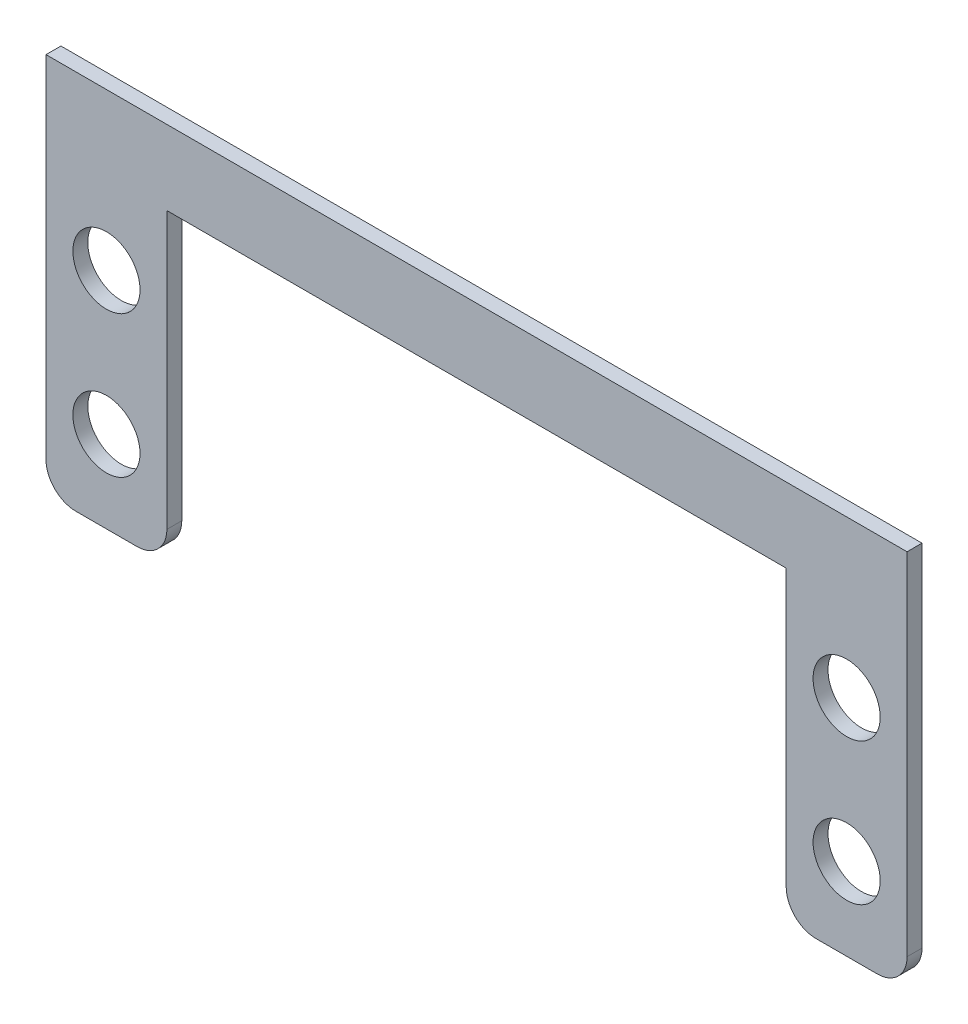
ISO-10303-21;
HEADER;
FILE_DESCRIPTION(('STEP AP214'),'2;1');
FILE_NAME('part.step','',(''),(''),'','','');
FILE_SCHEMA(('AUTOMOTIVE_DESIGN { 1 0 10303 214 1 1 1 1 }'));
ENDSEC;
DATA;
#1=APPLICATION_CONTEXT('core data for automotive mechanical design processes');
#2=APPLICATION_PROTOCOL_DEFINITION('international standard','automotive_design',2000,#1);
#3=PRODUCT_CONTEXT('',#1,'mechanical');
#4=PRODUCT('Part','Part','',(#3));
#5=PRODUCT_RELATED_PRODUCT_CATEGORY('part','',(#4));
#6=PRODUCT_DEFINITION_FORMATION('','',#4);
#7=PRODUCT_DEFINITION_CONTEXT('part definition',#1,'design');
#8=PRODUCT_DEFINITION('design','',#6,#7);
#9=PRODUCT_DEFINITION_SHAPE('','',#8);
#10=(LENGTH_UNIT() NAMED_UNIT(*) SI_UNIT(.MILLI.,.METRE.));
#11=(NAMED_UNIT(*) PLANE_ANGLE_UNIT() SI_UNIT($,.RADIAN.));
#12=(NAMED_UNIT(*) SI_UNIT($,.STERADIAN.) SOLID_ANGLE_UNIT());
#13=UNCERTAINTY_MEASURE_WITH_UNIT(LENGTH_MEASURE(1.E-05),#10,'distance_accuracy_value','');
#14=(GEOMETRIC_REPRESENTATION_CONTEXT(3) GLOBAL_UNCERTAINTY_ASSIGNED_CONTEXT((#13)) GLOBAL_UNIT_ASSIGNED_CONTEXT((#10,
#11,#12)) REPRESENTATION_CONTEXT('',''));
#15=CARTESIAN_POINT('',(0.,0.,0.));
#16=DIRECTION('',(0.,0.,1.));
#17=DIRECTION('',(1.,0.,0.));
#18=AXIS2_PLACEMENT_3D('',#15,#16,#17);
#19=CARTESIAN_POINT('',(6.10000000000278,-18.5,1.));
#20=DIRECTION('',(0.,0.,-1.));
#21=DIRECTION('',(-1.,0.,0.));
#22=AXIS2_PLACEMENT_3D('',#19,#20,#21);
#23=CYLINDRICAL_SURFACE('',#22,2.);
#24=CARTESIAN_POINT('',(6.10000000000278,-18.5,0.));
#25=DIRECTION('',(0.,0.,1.));
#26=DIRECTION('',(1.,0.,0.));
#27=AXIS2_PLACEMENT_3D('',#24,#25,#26);
#28=CIRCLE('',#27,2.);
#29=CARTESIAN_POINT('',(8.10000000000278,-18.5,0.));
#30=VERTEX_POINT('',#29);
#31=CARTESIAN_POINT('',(6.10000000000277,-20.5,0.));
#32=VERTEX_POINT('',#31);
#33=EDGE_CURVE('E168',#30,#32,#28,.F.);
#34=ORIENTED_EDGE('',*,*,#33,.F.);
#35=DIRECTION('',(0.,0.,-1.));
#36=VECTOR('',#35,1.);
#37=CARTESIAN_POINT('',(8.10000000000278,-18.5,1.));
#38=LINE('',#37,#36);
#39=CARTESIAN_POINT('',(8.10000000000278,-18.5,1.));
#40=VERTEX_POINT('',#39);
#41=EDGE_CURVE('E11',#40,#30,#38,.T.);
#42=ORIENTED_EDGE('',*,*,#41,.F.);
#43=CARTESIAN_POINT('',(6.10000000000278,-18.5,1.));
#44=DIRECTION('',(0.,0.,1.));
#45=DIRECTION('',(1.,0.,0.));
#46=AXIS2_PLACEMENT_3D('',#43,#44,#45);
#47=CIRCLE('',#46,2.);
#48=CARTESIAN_POINT('',(6.10000000000277,-20.5,1.));
#49=VERTEX_POINT('',#48);
#50=EDGE_CURVE('E212',#40,#49,#47,.F.);
#51=ORIENTED_EDGE('',*,*,#50,.T.);
#52=DIRECTION('',(0.,0.,-1.));
#53=VECTOR('',#52,1.);
#54=CARTESIAN_POINT('',(6.10000000000277,-20.5,1.));
#55=LINE('',#54,#53);
#56=EDGE_CURVE('E54',#49,#32,#55,.T.);
#57=ORIENTED_EDGE('',*,*,#56,.T.);
#58=EDGE_LOOP('',(#34,#42,#51,#57));
#59=FACE_BOUND('',#58,.T.);
#60=ADVANCED_FACE('F38',(#59),#23,.T.);
#61=CARTESIAN_POINT('',(8.10000000000278,0.,1.));
#62=DIRECTION('',(1.,0.,0.));
#63=DIRECTION('',(0.,1.,0.));
#64=AXIS2_PLACEMENT_3D('',#61,#62,#63);
#65=PLANE('',#64);
#66=DIRECTION('',(0.,-1.,0.));
#67=VECTOR('',#66,1.);
#68=CARTESIAN_POINT('',(8.10000000000278,0.,0.));
#69=LINE('',#68,#67);
#70=CARTESIAN_POINT('',(8.10000000000278,4.99999999999987,0.));
#71=VERTEX_POINT('',#70);
#72=EDGE_CURVE('E170',#71,#30,#69,.T.);
#73=ORIENTED_EDGE('',*,*,#72,.F.);
#74=DIRECTION('',(0.,0.,-1.));
#75=VECTOR('',#74,1.);
#76=CARTESIAN_POINT('',(8.10000000000278,4.99999999999987,1.));
#77=LINE('',#76,#75);
#78=CARTESIAN_POINT('',(8.10000000000278,4.99999999999987,1.));
#79=VERTEX_POINT('',#78);
#80=EDGE_CURVE('E46',#79,#71,#77,.T.);
#81=ORIENTED_EDGE('',*,*,#80,.F.);
#82=DIRECTION('',(0.,-1.,0.));
#83=VECTOR('',#82,1.);
#84=CARTESIAN_POINT('',(8.10000000000278,0.,1.));
#85=LINE('',#84,#83);
#86=EDGE_CURVE('E250',#79,#40,#85,.T.);
#87=ORIENTED_EDGE('',*,*,#86,.T.);
#88=ORIENTED_EDGE('',*,*,#41,.T.);
#89=EDGE_LOOP('',(#73,#81,#87,#88));
#90=FACE_BOUND('',#89,.T.);
#91=ADVANCED_FACE('F237',(#90),#65,.T.);
#92=CARTESIAN_POINT('',(0.,4.99999999999987,1.));
#93=DIRECTION('',(0.,1.,0.));
#94=DIRECTION('',(0.,0.,1.));
#95=AXIS2_PLACEMENT_3D('',#92,#93,#94);
#96=PLANE('',#95);
#97=DIRECTION('',(1.,0.,0.));
#98=VECTOR('',#97,1.);
#99=CARTESIAN_POINT('',(0.,4.99999999999987,0.));
#100=LINE('',#99,#98);
#101=CARTESIAN_POINT('',(-49.6000000000183,4.99999999999987,0.));
#102=VERTEX_POINT('',#101);
#103=EDGE_CURVE('E173',#102,#71,#100,.T.);
#104=ORIENTED_EDGE('',*,*,#103,.F.);
#105=DIRECTION('',(0.,0.,-1.));
#106=VECTOR('',#105,1.);
#107=CARTESIAN_POINT('',(-49.6000000000183,4.99999999999987,1.));
#108=LINE('',#107,#106);
#109=CARTESIAN_POINT('',(-49.6000000000183,4.99999999999987,1.));
#110=VERTEX_POINT('',#109);
#111=EDGE_CURVE('E226',#110,#102,#108,.T.);
#112=ORIENTED_EDGE('',*,*,#111,.F.);
#113=DIRECTION('',(1.,0.,0.));
#114=VECTOR('',#113,1.);
#115=CARTESIAN_POINT('',(0.,4.99999999999987,1.));
#116=LINE('',#115,#114);
#117=EDGE_CURVE('E233',#110,#79,#116,.T.);
#118=ORIENTED_EDGE('',*,*,#117,.T.);
#119=ORIENTED_EDGE('',*,*,#80,.T.);
#120=EDGE_LOOP('',(#104,#112,#118,#119));
#121=FACE_BOUND('',#120,.T.);
#122=ADVANCED_FACE('F231',(#121),#96,.T.);
#123=CARTESIAN_POINT('',(-49.6000000000183,0.,1.));
#124=DIRECTION('',(-1.,0.,0.));
#125=DIRECTION('',(0.,0.,1.));
#126=AXIS2_PLACEMENT_3D('',#123,#124,#125);
#127=PLANE('',#126);
#128=DIRECTION('',(0.,1.,0.));
#129=VECTOR('',#128,1.);
#130=CARTESIAN_POINT('',(-49.6000000000183,0.,0.));
#131=LINE('',#130,#129);
#132=CARTESIAN_POINT('',(-49.6000000000183,-18.5,0.));
#133=VERTEX_POINT('',#132);
#134=EDGE_CURVE('E176',#133,#102,#131,.T.);
#135=ORIENTED_EDGE('',*,*,#134,.F.);
#136=DIRECTION('',(0.,0.,-1.));
#137=VECTOR('',#136,1.);
#138=CARTESIAN_POINT('',(-49.6000000000183,-18.5,1.));
#139=LINE('',#138,#137);
#140=CARTESIAN_POINT('',(-49.6000000000183,-18.5,1.));
#141=VERTEX_POINT('',#140);
#142=EDGE_CURVE('E224',#141,#133,#139,.T.);
#143=ORIENTED_EDGE('',*,*,#142,.F.);
#144=DIRECTION('',(0.,1.,0.));
#145=VECTOR('',#144,1.);
#146=CARTESIAN_POINT('',(-49.6000000000183,0.,1.));
#147=LINE('',#146,#145);
#148=EDGE_CURVE('E247',#141,#110,#147,.T.);
#149=ORIENTED_EDGE('',*,*,#148,.T.);
#150=ORIENTED_EDGE('',*,*,#111,.T.);
#151=EDGE_LOOP('',(#135,#143,#149,#150));
#152=FACE_BOUND('',#151,.T.);
#153=ADVANCED_FACE('F244',(#152),#127,.T.);
#154=CARTESIAN_POINT('',(-47.6000000000183,-18.5,1.));
#155=DIRECTION('',(0.,0.,-1.));
#156=DIRECTION('',(-1.,0.,0.));
#157=AXIS2_PLACEMENT_3D('',#154,#155,#156);
#158=CYLINDRICAL_SURFACE('',#157,2.);
#159=CARTESIAN_POINT('',(-47.6000000000183,-18.5,0.));
#160=DIRECTION('',(0.,0.,1.));
#161=DIRECTION('',(1.,0.,0.));
#162=AXIS2_PLACEMENT_3D('',#159,#160,#161);
#163=CIRCLE('',#162,2.);
#164=CARTESIAN_POINT('',(-47.6000000000183,-20.5,0.));
#165=VERTEX_POINT('',#164);
#166=EDGE_CURVE('E179',#165,#133,#163,.F.);
#167=ORIENTED_EDGE('',*,*,#166,.F.);
#168=DIRECTION('',(0.,0.,-1.));
#169=VECTOR('',#168,1.);
#170=CARTESIAN_POINT('',(-47.6000000000183,-20.5,1.));
#171=LINE('',#170,#169);
#172=CARTESIAN_POINT('',(-47.6000000000183,-20.5,1.));
#173=VERTEX_POINT('',#172);
#174=EDGE_CURVE('E222',#173,#165,#171,.T.);
#175=ORIENTED_EDGE('',*,*,#174,.F.);
#176=CARTESIAN_POINT('',(-47.6000000000183,-18.5,1.));
#177=DIRECTION('',(0.,0.,1.));
#178=DIRECTION('',(1.,0.,0.));
#179=AXIS2_PLACEMENT_3D('',#176,#177,#178);
#180=CIRCLE('',#179,2.);
#181=EDGE_CURVE('E252',#173,#141,#180,.F.);
#182=ORIENTED_EDGE('',*,*,#181,.T.);
#183=ORIENTED_EDGE('',*,*,#142,.T.);
#184=EDGE_LOOP('',(#167,#175,#182,#183));
#185=FACE_BOUND('',#184,.T.);
#186=ADVANCED_FACE('F296',(#185),#158,.T.);
#187=CARTESIAN_POINT('',(0.,-20.4999999999999,1.));
#188=DIRECTION('',(0.,-1.,0.));
#189=DIRECTION('',(1.,0.,0.));
#190=AXIS2_PLACEMENT_3D('',#187,#188,#189);
#191=PLANE('',#190);
#192=DIRECTION('',(-1.,0.,0.));
#193=VECTOR('',#192,1.);
#194=CARTESIAN_POINT('',(0.,-20.4999999999999,0.));
#195=LINE('',#194,#193);
#196=CARTESIAN_POINT('',(-43.5,-20.5,0.));
#197=VERTEX_POINT('',#196);
#198=EDGE_CURVE('E182',#197,#165,#195,.T.);
#199=ORIENTED_EDGE('',*,*,#198,.F.);
#200=DIRECTION('',(0.,0.,-1.));
#201=VECTOR('',#200,1.);
#202=CARTESIAN_POINT('',(-43.5,-20.5,1.));
#203=LINE('',#202,#201);
#204=CARTESIAN_POINT('',(-43.5,-20.5,1.));
#205=VERTEX_POINT('',#204);
#206=EDGE_CURVE('E220',#205,#197,#203,.T.);
#207=ORIENTED_EDGE('',*,*,#206,.F.);
#208=DIRECTION('',(-1.,0.,0.));
#209=VECTOR('',#208,1.);
#210=CARTESIAN_POINT('',(0.,-20.4999999999999,1.));
#211=LINE('',#210,#209);
#212=EDGE_CURVE('E258',#205,#173,#211,.T.);
#213=ORIENTED_EDGE('',*,*,#212,.T.);
#214=ORIENTED_EDGE('',*,*,#174,.T.);
#215=EDGE_LOOP('',(#199,#207,#213,#214));
#216=FACE_BOUND('',#215,.T.);
#217=ADVANCED_FACE('F299',(#216),#191,.T.);
#218=CARTESIAN_POINT('',(-43.5,-18.5,1.));
#219=DIRECTION('',(0.,0.,-1.));
#220=DIRECTION('',(-1.,0.,0.));
#221=AXIS2_PLACEMENT_3D('',#218,#219,#220);
#222=CYLINDRICAL_SURFACE('',#221,2.);
#223=CARTESIAN_POINT('',(-43.5,-18.5,0.));
#224=DIRECTION('',(0.,0.,1.));
#225=DIRECTION('',(1.,0.,0.));
#226=AXIS2_PLACEMENT_3D('',#223,#224,#225);
#227=CIRCLE('',#226,2.);
#228=CARTESIAN_POINT('',(-41.5,-18.5,0.));
#229=VERTEX_POINT('',#228);
#230=EDGE_CURVE('E185',#229,#197,#227,.F.);
#231=ORIENTED_EDGE('',*,*,#230,.F.);
#232=DIRECTION('',(0.,0.,-1.));
#233=VECTOR('',#232,1.);
#234=CARTESIAN_POINT('',(-41.5,-18.5,1.));
#235=LINE('',#234,#233);
#236=CARTESIAN_POINT('',(-41.5,-18.5,1.));
#237=VERTEX_POINT('',#236);
#238=EDGE_CURVE('E218',#237,#229,#235,.T.);
#239=ORIENTED_EDGE('',*,*,#238,.F.);
#240=CARTESIAN_POINT('',(-43.5,-18.5,1.));
#241=DIRECTION('',(0.,0.,1.));
#242=DIRECTION('',(1.,0.,0.));
#243=AXIS2_PLACEMENT_3D('',#240,#241,#242);
#244=CIRCLE('',#243,2.);
#245=EDGE_CURVE('E261',#237,#205,#244,.F.);
#246=ORIENTED_EDGE('',*,*,#245,.T.);
#247=ORIENTED_EDGE('',*,*,#206,.T.);
#248=EDGE_LOOP('',(#231,#239,#246,#247));
#249=FACE_BOUND('',#248,.T.);
#250=ADVANCED_FACE('F303',(#249),#222,.T.);
#251=CARTESIAN_POINT('',(-41.5,0.,1.));
#252=DIRECTION('',(1.,0.,0.));
#253=DIRECTION('',(0.,0.,-1.));
#254=AXIS2_PLACEMENT_3D('',#251,#252,#253);
#255=PLANE('',#254);
#256=DIRECTION('',(0.,-1.,0.));
#257=VECTOR('',#256,1.);
#258=CARTESIAN_POINT('',(-41.5,0.,0.));
#259=LINE('',#258,#257);
#260=CARTESIAN_POINT('',(-41.5,0.,0.));
#261=VERTEX_POINT('',#260);
#262=EDGE_CURVE('E188',#261,#229,#259,.T.);
#263=ORIENTED_EDGE('',*,*,#262,.F.);
#264=DIRECTION('',(0.,0.,-1.));
#265=VECTOR('',#264,1.);
#266=CARTESIAN_POINT('',(-41.5,0.,1.));
#267=LINE('',#266,#265);
#268=CARTESIAN_POINT('',(-41.5,0.,1.));
#269=VERTEX_POINT('',#268);
#270=EDGE_CURVE('E216',#269,#261,#267,.T.);
#271=ORIENTED_EDGE('',*,*,#270,.F.);
#272=DIRECTION('',(0.,-1.,0.));
#273=VECTOR('',#272,1.);
#274=CARTESIAN_POINT('',(-41.5,0.,1.));
#275=LINE('',#274,#273);
#276=EDGE_CURVE('E264',#269,#237,#275,.T.);
#277=ORIENTED_EDGE('',*,*,#276,.T.);
#278=ORIENTED_EDGE('',*,*,#238,.T.);
#279=EDGE_LOOP('',(#263,#271,#277,#278));
#280=FACE_BOUND('',#279,.T.);
#281=ADVANCED_FACE('F307',(#280),#255,.T.);
#282=CARTESIAN_POINT('',(0.,0.,1.));
#283=DIRECTION('',(0.,-1.,0.));
#284=DIRECTION('',(1.,0.,0.));
#285=AXIS2_PLACEMENT_3D('',#282,#283,#284);
#286=PLANE('',#285);
#287=DIRECTION('',(-1.,0.,0.));
#288=VECTOR('',#287,1.);
#289=CARTESIAN_POINT('',(0.,0.,0.));
#290=LINE('',#289,#288);
#291=CARTESIAN_POINT('',(0.,0.,0.));
#292=VERTEX_POINT('',#291);
#293=EDGE_CURVE('E191',#292,#261,#290,.T.);
#294=ORIENTED_EDGE('',*,*,#293,.F.);
#295=DIRECTION('',(0.,0.,-1.));
#296=VECTOR('',#295,1.);
#297=CARTESIAN_POINT('',(0.,0.,1.));
#298=LINE('',#297,#296);
#299=CARTESIAN_POINT('',(0.,0.,1.));
#300=VERTEX_POINT('',#299);
#301=EDGE_CURVE('E148',#300,#292,#298,.T.);
#302=ORIENTED_EDGE('',*,*,#301,.F.);
#303=DIRECTION('',(-1.,0.,0.));
#304=VECTOR('',#303,1.);
#305=CARTESIAN_POINT('',(0.,0.,1.));
#306=LINE('',#305,#304);
#307=EDGE_CURVE('E138',#300,#269,#306,.T.);
#308=ORIENTED_EDGE('',*,*,#307,.T.);
#309=ORIENTED_EDGE('',*,*,#270,.T.);
#310=EDGE_LOOP('',(#294,#302,#308,#309));
#311=FACE_BOUND('',#310,.T.);
#312=ADVANCED_FACE('F268',(#311),#286,.T.);
#313=CARTESIAN_POINT('',(0.,0.,1.));
#314=DIRECTION('',(1.,0.,0.));
#315=DIRECTION('',(0.,1.,0.));
#316=AXIS2_PLACEMENT_3D('',#313,#314,#315);
#317=PLANE('',#316);
#318=DIRECTION('',(0.,-1.,0.));
#319=VECTOR('',#318,1.);
#320=CARTESIAN_POINT('',(0.,0.,0.));
#321=LINE('',#320,#319);
#322=CARTESIAN_POINT('',(0.,-18.5,0.));
#323=VERTEX_POINT('',#322);
#324=EDGE_CURVE('E145',#292,#323,#321,.T.);
#325=ORIENTED_EDGE('',*,*,#324,.T.);
#326=DIRECTION('',(0.,0.,-1.));
#327=VECTOR('',#326,1.);
#328=CARTESIAN_POINT('',(0.,-18.5,1.));
#329=LINE('',#328,#327);
#330=CARTESIAN_POINT('',(0.,-18.5,1.));
#331=VERTEX_POINT('',#330);
#332=EDGE_CURVE('E142',#331,#323,#329,.T.);
#333=ORIENTED_EDGE('',*,*,#332,.F.);
#334=DIRECTION('',(0.,-1.,0.));
#335=VECTOR('',#334,1.);
#336=CARTESIAN_POINT('',(0.,0.,1.));
#337=LINE('',#336,#335);
#338=EDGE_CURVE('E129',#300,#331,#337,.T.);
#339=ORIENTED_EDGE('',*,*,#338,.F.);
#340=ORIENTED_EDGE('',*,*,#301,.T.);
#341=EDGE_LOOP('',(#325,#333,#339,#340));
#342=FACE_BOUND('',#341,.T.);
#343=ADVANCED_FACE('F143',(#342),#317,.F.);
#344=CARTESIAN_POINT('',(2.,-18.5,1.));
#345=DIRECTION('',(0.,0.,-1.));
#346=DIRECTION('',(-1.,0.,0.));
#347=AXIS2_PLACEMENT_3D('',#344,#345,#346);
#348=CYLINDRICAL_SURFACE('',#347,2.);
#349=CARTESIAN_POINT('',(2.,-18.5,0.));
#350=DIRECTION('',(0.,0.,1.));
#351=DIRECTION('',(1.,0.,0.));
#352=AXIS2_PLACEMENT_3D('',#349,#350,#351);
#353=CIRCLE('',#352,2.);
#354=CARTESIAN_POINT('',(2.00000000000002,-20.5,0.));
#355=VERTEX_POINT('',#354);
#356=EDGE_CURVE('E195',#323,#355,#353,.T.);
#357=ORIENTED_EDGE('',*,*,#356,.T.);
#358=DIRECTION('',(0.,0.,-1.));
#359=VECTOR('',#358,1.);
#360=CARTESIAN_POINT('',(2.00000000000002,-20.5,1.));
#361=LINE('',#360,#359);
#362=CARTESIAN_POINT('',(2.00000000000002,-20.5,1.));
#363=VERTEX_POINT('',#362);
#364=EDGE_CURVE('E92',#363,#355,#361,.T.);
#365=ORIENTED_EDGE('',*,*,#364,.F.);
#366=CARTESIAN_POINT('',(2.,-18.5,1.));
#367=DIRECTION('',(0.,0.,1.));
#368=DIRECTION('',(1.,0.,0.));
#369=AXIS2_PLACEMENT_3D('',#366,#367,#368);
#370=CIRCLE('',#369,2.);
#371=EDGE_CURVE('E135',#331,#363,#370,.T.);
#372=ORIENTED_EDGE('',*,*,#371,.F.);
#373=ORIENTED_EDGE('',*,*,#332,.T.);
#374=EDGE_LOOP('',(#357,#365,#372,#373));
#375=FACE_BOUND('',#374,.T.);
#376=ADVANCED_FACE('F150',(#375),#348,.T.);
#377=CARTESIAN_POINT('',(-45.5499999999999,-15.,1.));
#378=DIRECTION('',(0.,0.,-1.));
#379=DIRECTION('',(-1.,0.,0.));
#380=AXIS2_PLACEMENT_3D('',#377,#378,#379);
#381=CYLINDRICAL_SURFACE('',#380,2.25);
#382=CARTESIAN_POINT('',(-45.5499999999999,-15.,1.));
#383=DIRECTION('',(0.,0.,1.));
#384=DIRECTION('',(1.,0.,0.));
#385=AXIS2_PLACEMENT_3D('',#382,#383,#384);
#386=CIRCLE('',#385,2.25);
#387=CARTESIAN_POINT('',(-43.2999999999999,-15.,1.));
#388=VERTEX_POINT('',#387);
#389=EDGE_CURVE('E162',#388,#388,#386,.T.);
#390=ORIENTED_EDGE('',*,*,#389,.T.);
#391=EDGE_LOOP('',(#390));
#392=FACE_BOUND('',#391,.T.);
#393=CARTESIAN_POINT('',(-45.5499999999999,-15.,0.));
#394=DIRECTION('',(0.,0.,1.));
#395=DIRECTION('',(1.,0.,0.));
#396=AXIS2_PLACEMENT_3D('',#393,#394,#395);
#397=CIRCLE('',#396,2.25);
#398=CARTESIAN_POINT('',(-43.2999999999999,-15.,0.));
#399=VERTEX_POINT('',#398);
#400=EDGE_CURVE('E206',#399,#399,#397,.T.);
#401=ORIENTED_EDGE('',*,*,#400,.F.);
#402=EDGE_LOOP('',(#401));
#403=FACE_BOUND('',#402,.T.);
#404=ADVANCED_FACE('F316',(#392,#403),#381,.F.);
#405=CARTESIAN_POINT('',(4.05000000000012,-5.5,1.));
#406=DIRECTION('',(0.,0.,-1.));
#407=DIRECTION('',(-1.,0.,0.));
#408=AXIS2_PLACEMENT_3D('',#405,#406,#407);
#409=CYLINDRICAL_SURFACE('',#408,2.25);
#410=CARTESIAN_POINT('',(4.05000000000012,-5.5,1.));
#411=DIRECTION('',(0.,0.,1.));
#412=DIRECTION('',(1.,0.,0.));
#413=AXIS2_PLACEMENT_3D('',#410,#411,#412);
#414=CIRCLE('',#413,2.25);
#415=CARTESIAN_POINT('',(6.30000000000012,-5.5,1.));
#416=VERTEX_POINT('',#415);
#417=EDGE_CURVE('E159',#416,#416,#414,.T.);
#418=ORIENTED_EDGE('',*,*,#417,.T.);
#419=EDGE_LOOP('',(#418));
#420=FACE_BOUND('',#419,.T.);
#421=CARTESIAN_POINT('',(4.05000000000012,-5.5,0.));
#422=DIRECTION('',(0.,0.,1.));
#423=DIRECTION('',(1.,0.,0.));
#424=AXIS2_PLACEMENT_3D('',#421,#422,#423);
#425=CIRCLE('',#424,2.25);
#426=CARTESIAN_POINT('',(6.30000000000012,-5.5,0.));
#427=VERTEX_POINT('',#426);
#428=EDGE_CURVE('E203',#427,#427,#425,.T.);
#429=ORIENTED_EDGE('',*,*,#428,.F.);
#430=EDGE_LOOP('',(#429));
#431=FACE_BOUND('',#430,.T.);
#432=ADVANCED_FACE('F281',(#420,#431),#409,.F.);
#433=CARTESIAN_POINT('',(4.05000000000012,-15.,1.));
#434=DIRECTION('',(0.,0.,-1.));
#435=DIRECTION('',(-1.,0.,0.));
#436=AXIS2_PLACEMENT_3D('',#433,#434,#435);
#437=CYLINDRICAL_SURFACE('',#436,2.25);
#438=CARTESIAN_POINT('',(4.05000000000012,-15.,1.));
#439=DIRECTION('',(0.,0.,1.));
#440=DIRECTION('',(1.,0.,0.));
#441=AXIS2_PLACEMENT_3D('',#438,#439,#440);
#442=CIRCLE('',#441,2.25);
#443=CARTESIAN_POINT('',(6.30000000000012,-15.,1.));
#444=VERTEX_POINT('',#443);
#445=EDGE_CURVE('E153',#444,#444,#442,.T.);
#446=ORIENTED_EDGE('',*,*,#445,.T.);
#447=EDGE_LOOP('',(#446));
#448=FACE_BOUND('',#447,.T.);
#449=CARTESIAN_POINT('',(4.05000000000012,-15.,0.));
#450=DIRECTION('',(0.,0.,1.));
#451=DIRECTION('',(1.,0.,0.));
#452=AXIS2_PLACEMENT_3D('',#449,#450,#451);
#453=CIRCLE('',#452,2.25);
#454=CARTESIAN_POINT('',(6.30000000000012,-15.,0.));
#455=VERTEX_POINT('',#454);
#456=EDGE_CURVE('E200',#455,#455,#453,.T.);
#457=ORIENTED_EDGE('',*,*,#456,.F.);
#458=EDGE_LOOP('',(#457));
#459=FACE_BOUND('',#458,.T.);
#460=ADVANCED_FACE('F273',(#448,#459),#437,.F.);
#461=CARTESIAN_POINT('',(0.,-20.5,1.));
#462=DIRECTION('',(0.,-1.,0.));
#463=DIRECTION('',(0.,0.,-1.));
#464=AXIS2_PLACEMENT_3D('',#461,#462,#463);
#465=PLANE('',#464);
#466=DIRECTION('',(-1.,0.,0.));
#467=VECTOR('',#466,1.);
#468=CARTESIAN_POINT('',(0.,-20.5,0.));
#469=LINE('',#468,#467);
#470=EDGE_CURVE('E197',#32,#355,#469,.T.);
#471=ORIENTED_EDGE('',*,*,#470,.F.);
#472=ORIENTED_EDGE('',*,*,#56,.F.);
#473=DIRECTION('',(-1.,0.,0.));
#474=VECTOR('',#473,1.);
#475=CARTESIAN_POINT('',(0.,-20.5,1.));
#476=LINE('',#475,#474);
#477=EDGE_CURVE('E151',#49,#363,#476,.T.);
#478=ORIENTED_EDGE('',*,*,#477,.T.);
#479=ORIENTED_EDGE('',*,*,#364,.T.);
#480=EDGE_LOOP('',(#471,#472,#478,#479));
#481=FACE_BOUND('',#480,.T.);
#482=ADVANCED_FACE('F270',(#481),#465,.T.);
#483=CARTESIAN_POINT('',(-45.5499999999999,-5.50000000000001,1.));
#484=DIRECTION('',(0.,0.,-1.));
#485=DIRECTION('',(-1.,0.,0.));
#486=AXIS2_PLACEMENT_3D('',#483,#484,#485);
#487=CYLINDRICAL_SURFACE('',#486,2.25);
#488=CARTESIAN_POINT('',(-45.5499999999999,-5.50000000000001,1.));
#489=DIRECTION('',(0.,0.,1.));
#490=DIRECTION('',(1.,0.,0.));
#491=AXIS2_PLACEMENT_3D('',#488,#489,#490);
#492=CIRCLE('',#491,2.25);
#493=CARTESIAN_POINT('',(-43.2999999999999,-5.50000000000001,1.));
#494=VERTEX_POINT('',#493);
#495=EDGE_CURVE('E165',#494,#494,#492,.T.);
#496=ORIENTED_EDGE('',*,*,#495,.T.);
#497=EDGE_LOOP('',(#496));
#498=FACE_BOUND('',#497,.T.);
#499=CARTESIAN_POINT('',(-45.5499999999999,-5.50000000000001,0.));
#500=DIRECTION('',(0.,0.,1.));
#501=DIRECTION('',(1.,0.,0.));
#502=AXIS2_PLACEMENT_3D('',#499,#500,#501);
#503=CIRCLE('',#502,2.25);
#504=CARTESIAN_POINT('',(-43.2999999999999,-5.50000000000001,0.));
#505=VERTEX_POINT('',#504);
#506=EDGE_CURVE('E209',#505,#505,#503,.T.);
#507=ORIENTED_EDGE('',*,*,#506,.F.);
#508=EDGE_LOOP('',(#507));
#509=FACE_BOUND('',#508,.T.);
#510=ADVANCED_FACE('F272',(#498,#509),#487,.F.);
#511=CARTESIAN_POINT('',(0.,0.,1.));
#512=DIRECTION('',(0.,0.,1.));
#513=DIRECTION('',(1.,0.,0.));
#514=AXIS2_PLACEMENT_3D('',#511,#512,#513);
#515=PLANE('',#514);
#516=ORIENTED_EDGE('',*,*,#50,.F.);
#517=ORIENTED_EDGE('',*,*,#86,.F.);
#518=ORIENTED_EDGE('',*,*,#117,.F.);
#519=ORIENTED_EDGE('',*,*,#148,.F.);
#520=ORIENTED_EDGE('',*,*,#181,.F.);
#521=ORIENTED_EDGE('',*,*,#212,.F.);
#522=ORIENTED_EDGE('',*,*,#245,.F.);
#523=ORIENTED_EDGE('',*,*,#276,.F.);
#524=ORIENTED_EDGE('',*,*,#307,.F.);
#525=ORIENTED_EDGE('',*,*,#338,.T.);
#526=ORIENTED_EDGE('',*,*,#371,.T.);
#527=ORIENTED_EDGE('',*,*,#477,.F.);
#528=EDGE_LOOP('',(#516,#517,#518,#519,#520,#521,#522,#523,#524,#525,#526,#527));
#529=FACE_BOUND('',#528,.T.);
#530=ORIENTED_EDGE('',*,*,#445,.F.);
#531=EDGE_LOOP('',(#530));
#532=FACE_BOUND('',#531,.T.);
#533=ORIENTED_EDGE('',*,*,#417,.F.);
#534=EDGE_LOOP('',(#533));
#535=FACE_BOUND('',#534,.T.);
#536=ORIENTED_EDGE('',*,*,#389,.F.);
#537=EDGE_LOOP('',(#536));
#538=FACE_BOUND('',#537,.T.);
#539=ORIENTED_EDGE('',*,*,#495,.F.);
#540=EDGE_LOOP('',(#539));
#541=FACE_BOUND('',#540,.T.);
#542=ADVANCED_FACE('F131',(#529,#532,#535,#538,#541),#515,.T.);
#543=CARTESIAN_POINT('',(0.,0.,0.));
#544=DIRECTION('',(0.,0.,1.));
#545=DIRECTION('',(1.,0.,0.));
#546=AXIS2_PLACEMENT_3D('',#543,#544,#545);
#547=PLANE('',#546);
#548=ORIENTED_EDGE('',*,*,#33,.T.);
#549=ORIENTED_EDGE('',*,*,#470,.T.);
#550=ORIENTED_EDGE('',*,*,#356,.F.);
#551=ORIENTED_EDGE('',*,*,#324,.F.);
#552=ORIENTED_EDGE('',*,*,#293,.T.);
#553=ORIENTED_EDGE('',*,*,#262,.T.);
#554=ORIENTED_EDGE('',*,*,#230,.T.);
#555=ORIENTED_EDGE('',*,*,#198,.T.);
#556=ORIENTED_EDGE('',*,*,#166,.T.);
#557=ORIENTED_EDGE('',*,*,#134,.T.);
#558=ORIENTED_EDGE('',*,*,#103,.T.);
#559=ORIENTED_EDGE('',*,*,#72,.T.);
#560=EDGE_LOOP('',(#548,#549,#550,#551,#552,#553,#554,#555,#556,#557,#558,#559));
#561=FACE_BOUND('',#560,.T.);
#562=ORIENTED_EDGE('',*,*,#456,.T.);
#563=EDGE_LOOP('',(#562));
#564=FACE_BOUND('',#563,.T.);
#565=ORIENTED_EDGE('',*,*,#428,.T.);
#566=EDGE_LOOP('',(#565));
#567=FACE_BOUND('',#566,.T.);
#568=ORIENTED_EDGE('',*,*,#400,.T.);
#569=EDGE_LOOP('',(#568));
#570=FACE_BOUND('',#569,.T.);
#571=ORIENTED_EDGE('',*,*,#506,.T.);
#572=EDGE_LOOP('',(#571));
#573=FACE_BOUND('',#572,.T.);
#574=ADVANCED_FACE('F239',(#561,#564,#567,#570,#573),#547,.F.);
#575=CLOSED_SHELL('',(#60,#91,#122,#153,#186,#217,#250,#281,#312,#343,#376,#404,#432,#460,#482,
#510,#542,#574));
#576=MANIFOLD_SOLID_BREP('B2',#575);
#577=ADVANCED_BREP_SHAPE_REPRESENTATION('',(#18,#576),#14);
#578=SHAPE_DEFINITION_REPRESENTATION(#9,#577);
ENDSEC;
END-ISO-10303-21;
